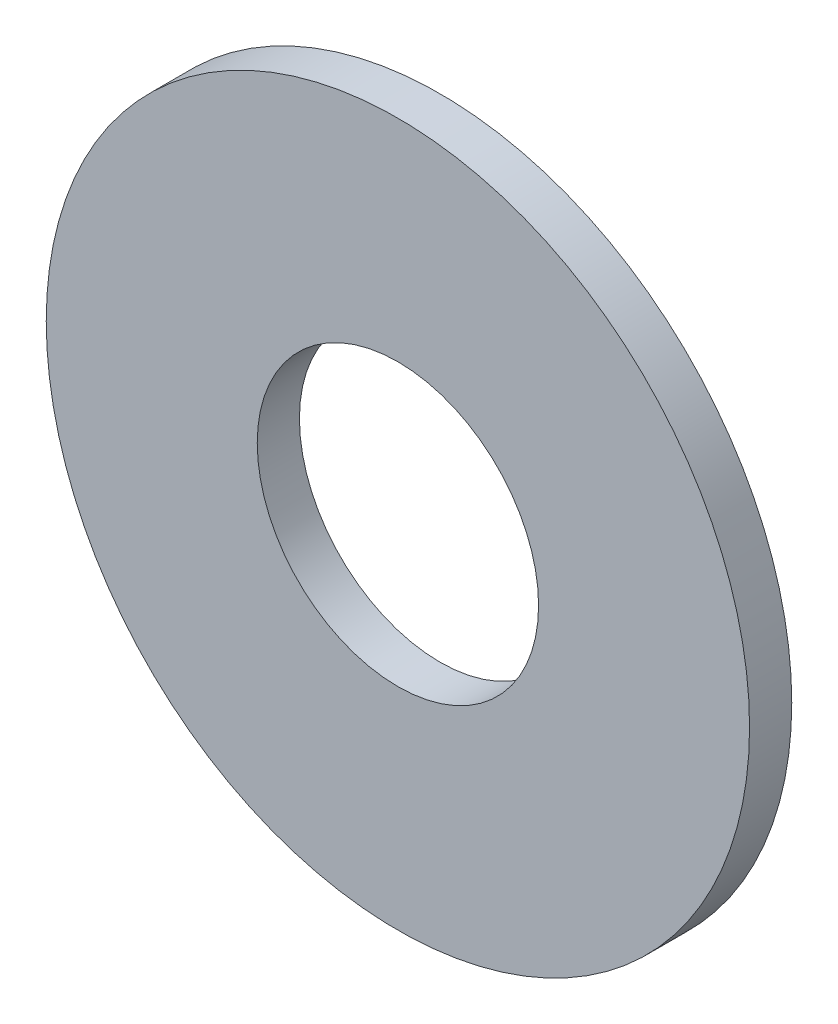
ISO-10303-21;
HEADER;
FILE_DESCRIPTION(('STEP AP214'),'2;1');
FILE_NAME('part.step','',(''),(''),'','','');
FILE_SCHEMA(('AUTOMOTIVE_DESIGN { 1 0 10303 214 1 1 1 1 }'));
ENDSEC;
DATA;
#1=APPLICATION_CONTEXT('core data for automotive mechanical design processes');
#2=APPLICATION_PROTOCOL_DEFINITION('international standard','automotive_design',2000,#1);
#3=PRODUCT_CONTEXT('',#1,'mechanical');
#4=PRODUCT('Part','Part','',(#3));
#5=PRODUCT_RELATED_PRODUCT_CATEGORY('part','',(#4));
#6=PRODUCT_DEFINITION_FORMATION('','',#4);
#7=PRODUCT_DEFINITION_CONTEXT('part definition',#1,'design');
#8=PRODUCT_DEFINITION('design','',#6,#7);
#9=PRODUCT_DEFINITION_SHAPE('','',#8);
#10=(LENGTH_UNIT() NAMED_UNIT(*) SI_UNIT(.MILLI.,.METRE.));
#11=(NAMED_UNIT(*) PLANE_ANGLE_UNIT() SI_UNIT($,.RADIAN.));
#12=(NAMED_UNIT(*) SI_UNIT($,.STERADIAN.) SOLID_ANGLE_UNIT());
#13=UNCERTAINTY_MEASURE_WITH_UNIT(LENGTH_MEASURE(1.E-05),#10,'distance_accuracy_value','');
#14=(GEOMETRIC_REPRESENTATION_CONTEXT(3) GLOBAL_UNCERTAINTY_ASSIGNED_CONTEXT((#13)) GLOBAL_UNIT_ASSIGNED_CONTEXT((#10,
#11,#12)) REPRESENTATION_CONTEXT('',''));
#15=CARTESIAN_POINT('',(0.,0.,0.));
#16=DIRECTION('',(0.,0.,1.));
#17=DIRECTION('',(1.,0.,0.));
#18=AXIS2_PLACEMENT_3D('',#15,#16,#17);
#19=CARTESIAN_POINT('',(0.,0.,-0.3));
#20=DIRECTION('',(0.,0.,1.));
#21=DIRECTION('',(1.,0.,0.));
#22=AXIS2_PLACEMENT_3D('',#19,#20,#21);
#23=CYLINDRICAL_SURFACE('',#22,2.5);
#24=CARTESIAN_POINT('',(0.,0.,-0.3));
#25=DIRECTION('',(0.,0.,1.));
#26=DIRECTION('',(1.,0.,0.));
#27=AXIS2_PLACEMENT_3D('',#24,#25,#26);
#28=CIRCLE('',#27,2.5);
#29=CARTESIAN_POINT('',(2.5,0.,-0.3));
#30=VERTEX_POINT('',#29);
#31=EDGE_CURVE('E10',#30,#30,#28,.T.);
#32=ORIENTED_EDGE('',*,*,#31,.T.);
#33=EDGE_LOOP('',(#32));
#34=FACE_BOUND('',#33,.T.);
#35=CARTESIAN_POINT('',(0.,0.,0.));
#36=DIRECTION('',(0.,0.,1.));
#37=DIRECTION('',(1.,0.,0.));
#38=AXIS2_PLACEMENT_3D('',#35,#36,#37);
#39=CIRCLE('',#38,2.5);
#40=CARTESIAN_POINT('',(2.5,0.,0.));
#41=VERTEX_POINT('',#40);
#42=EDGE_CURVE('E34',#41,#41,#39,.T.);
#43=ORIENTED_EDGE('',*,*,#42,.F.);
#44=EDGE_LOOP('',(#43));
#45=FACE_BOUND('',#44,.T.);
#46=ADVANCED_FACE('F31',(#34,#45),#23,.T.);
#47=CARTESIAN_POINT('',(0.,0.,-0.3));
#48=DIRECTION('',(0.,0.,1.));
#49=DIRECTION('',(1.,0.,0.));
#50=AXIS2_PLACEMENT_3D('',#47,#48,#49);
#51=PLANE('',#50);
#52=CARTESIAN_POINT('',(0.,0.,-0.3));
#53=DIRECTION('',(0.,0.,1.));
#54=DIRECTION('',(1.,0.,0.));
#55=AXIS2_PLACEMENT_3D('',#52,#53,#54);
#56=CIRCLE('',#55,1.);
#57=CARTESIAN_POINT('',(1.,0.,-0.3));
#58=VERTEX_POINT('',#57);
#59=EDGE_CURVE('E41',#58,#58,#56,.T.);
#60=ORIENTED_EDGE('',*,*,#59,.T.);
#61=EDGE_LOOP('',(#60));
#62=FACE_BOUND('',#61,.T.);
#63=ORIENTED_EDGE('',*,*,#31,.F.);
#64=EDGE_LOOP('',(#63));
#65=FACE_BOUND('',#64,.T.);
#66=ADVANCED_FACE('F49',(#62,#65),#51,.F.);
#67=CARTESIAN_POINT('',(0.,0.,0.));
#68=DIRECTION('',(0.,0.,1.));
#69=DIRECTION('',(1.,0.,0.));
#70=AXIS2_PLACEMENT_3D('',#67,#68,#69);
#71=PLANE('',#70);
#72=CARTESIAN_POINT('',(0.,0.,0.));
#73=DIRECTION('',(0.,0.,1.));
#74=DIRECTION('',(1.,0.,0.));
#75=AXIS2_PLACEMENT_3D('',#72,#73,#74);
#76=CIRCLE('',#75,1.);
#77=CARTESIAN_POINT('',(1.,0.,0.));
#78=VERTEX_POINT('',#77);
#79=EDGE_CURVE('E43',#78,#78,#76,.T.);
#80=ORIENTED_EDGE('',*,*,#79,.F.);
#81=EDGE_LOOP('',(#80));
#82=FACE_BOUND('',#81,.T.);
#83=ORIENTED_EDGE('',*,*,#42,.T.);
#84=EDGE_LOOP('',(#83));
#85=FACE_BOUND('',#84,.T.);
#86=ADVANCED_FACE('F55',(#82,#85),#71,.T.);
#87=CARTESIAN_POINT('',(0.,0.,-0.3));
#88=DIRECTION('',(0.,0.,1.));
#89=DIRECTION('',(1.,0.,0.));
#90=AXIS2_PLACEMENT_3D('',#87,#88,#89);
#91=CYLINDRICAL_SURFACE('',#90,1.);
#92=ORIENTED_EDGE('',*,*,#59,.F.);
#93=EDGE_LOOP('',(#92));
#94=FACE_BOUND('',#93,.T.);
#95=ORIENTED_EDGE('',*,*,#79,.T.);
#96=EDGE_LOOP('',(#95));
#97=FACE_BOUND('',#96,.T.);
#98=ADVANCED_FACE('F52',(#94,#97),#91,.F.);
#99=CLOSED_SHELL('',(#46,#66,#86,#98));
#100=MANIFOLD_SOLID_BREP('B2',#99);
#101=ADVANCED_BREP_SHAPE_REPRESENTATION('',(#18,#100),#14);
#102=SHAPE_DEFINITION_REPRESENTATION(#9,#101);
ENDSEC;
END-ISO-10303-21;
